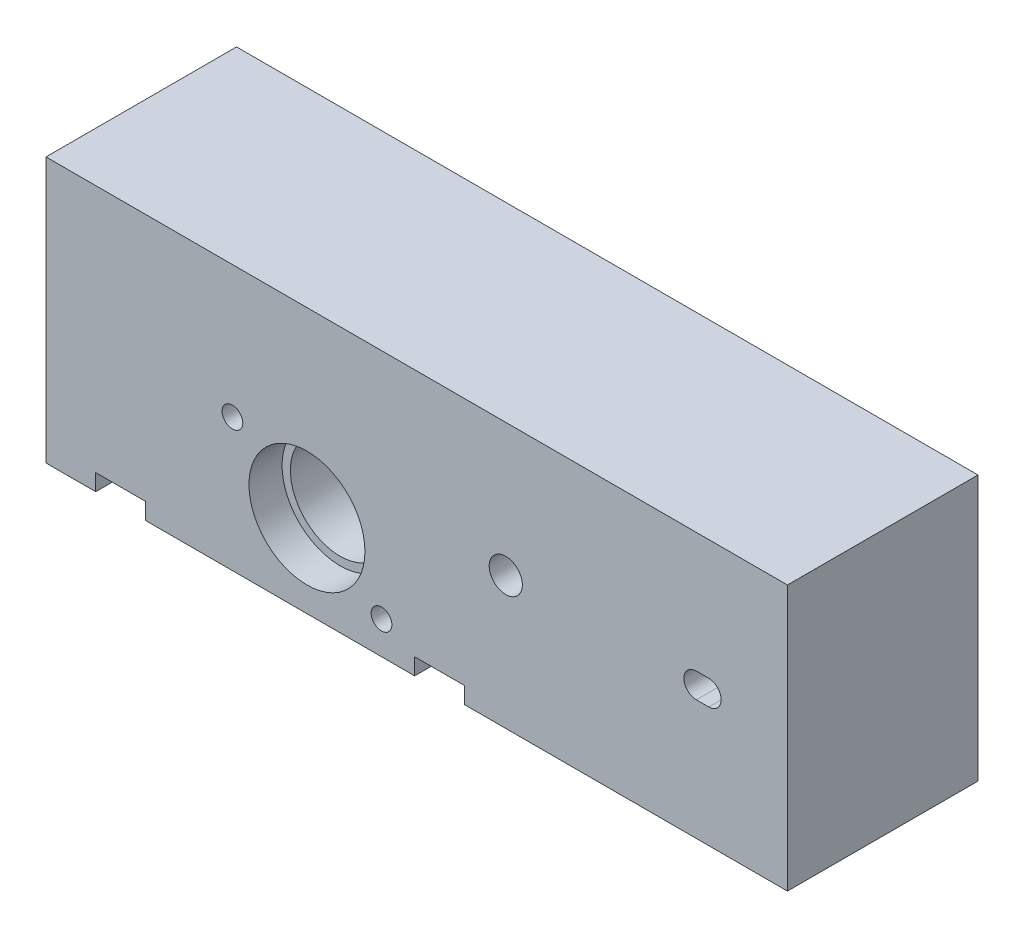
ISO-10303-21;
HEADER;
FILE_DESCRIPTION(('STEP AP214'),'2;1');
FILE_NAME('part.step','',(''),(''),'','','');
FILE_SCHEMA(('AUTOMOTIVE_DESIGN { 1 0 10303 214 1 1 1 1 }'));
ENDSEC;
DATA;
#1=APPLICATION_CONTEXT('core data for automotive mechanical design processes');
#2=APPLICATION_PROTOCOL_DEFINITION('international standard','automotive_design',2000,#1);
#3=PRODUCT_CONTEXT('',#1,'mechanical');
#4=PRODUCT('Part','Part','',(#3));
#5=PRODUCT_RELATED_PRODUCT_CATEGORY('part','',(#4));
#6=PRODUCT_DEFINITION_FORMATION('','',#4);
#7=PRODUCT_DEFINITION_CONTEXT('part definition',#1,'design');
#8=PRODUCT_DEFINITION('design','',#6,#7);
#9=PRODUCT_DEFINITION_SHAPE('','',#8);
#10=(LENGTH_UNIT() NAMED_UNIT(*) SI_UNIT(.MILLI.,.METRE.));
#11=(NAMED_UNIT(*) PLANE_ANGLE_UNIT() SI_UNIT($,.RADIAN.));
#12=(NAMED_UNIT(*) SI_UNIT($,.STERADIAN.) SOLID_ANGLE_UNIT());
#13=UNCERTAINTY_MEASURE_WITH_UNIT(LENGTH_MEASURE(1.E-05),#10,'distance_accuracy_value','');
#14=(GEOMETRIC_REPRESENTATION_CONTEXT(3) GLOBAL_UNCERTAINTY_ASSIGNED_CONTEXT((#13)) GLOBAL_UNIT_ASSIGNED_CONTEXT((#10,
#11,#12)) REPRESENTATION_CONTEXT('',''));
#15=CARTESIAN_POINT('',(0.,0.,0.));
#16=DIRECTION('',(0.,0.,1.));
#17=DIRECTION('',(1.,0.,0.));
#18=AXIS2_PLACEMENT_3D('',#15,#16,#17);
#19=CARTESIAN_POINT('',(0.,0.,73.025));
#20=DIRECTION('',(0.,0.,-1.));
#21=DIRECTION('',(-1.,0.,0.));
#22=AXIS2_PLACEMENT_3D('',#19,#20,#21);
#23=PLANE('',#22);
#24=CARTESIAN_POINT('',(34.13125,0.,73.025));
#25=DIRECTION('',(0.,0.,1.));
#26=DIRECTION('',(1.,0.,0.));
#27=AXIS2_PLACEMENT_3D('',#24,#25,#26);
#28=CIRCLE('',#27,6.35);
#29=CARTESIAN_POINT('',(40.48125,0.,73.025));
#30=VERTEX_POINT('',#29);
#31=EDGE_CURVE('E415',#30,#30,#28,.T.);
#32=ORIENTED_EDGE('',*,*,#31,.F.);
#33=EDGE_LOOP('',(#32));
#34=FACE_BOUND('',#33,.T.);
#35=CARTESIAN_POINT('',(-42.06875,-19.05,73.025));
#36=DIRECTION('',(0.,0.,1.));
#37=DIRECTION('',(1.,0.,0.));
#38=AXIS2_PLACEMENT_3D('',#35,#36,#37);
#39=CIRCLE('',#38,22.225);
#40=CARTESIAN_POINT('',(-19.84375,-19.05,73.025));
#41=VERTEX_POINT('',#40);
#42=EDGE_CURVE('E234',#41,#41,#39,.T.);
#43=ORIENTED_EDGE('',*,*,#42,.F.);
#44=EDGE_LOOP('',(#43));
#45=FACE_BOUND('',#44,.T.);
#46=CARTESIAN_POINT('',(111.91875,0.,73.025));
#47=DIRECTION('',(0.,0.,1.));
#48=DIRECTION('',(1.,0.,0.));
#49=AXIS2_PLACEMENT_3D('',#46,#47,#48);
#50=CIRCLE('',#49,4.7625);
#51=CARTESIAN_POINT('',(111.91875,-4.76250000000001,73.025));
#52=VERTEX_POINT('',#51);
#53=CARTESIAN_POINT('',(111.91875,4.76249999999999,73.025));
#54=VERTEX_POINT('',#53);
#55=EDGE_CURVE('E259',#52,#54,#50,.T.);
#56=ORIENTED_EDGE('',*,*,#55,.F.);
#57=DIRECTION('',(1.,0.,0.));
#58=VECTOR('',#57,1.);
#59=CARTESIAN_POINT('',(0.,-4.76250000000001,73.025));
#60=LINE('',#59,#58);
#61=CARTESIAN_POINT('',(107.15625,-4.76250000000001,73.025));
#62=VERTEX_POINT('',#61);
#63=EDGE_CURVE('E262',#62,#52,#60,.T.);
#64=ORIENTED_EDGE('',*,*,#63,.F.);
#65=CARTESIAN_POINT('',(107.15625,0.,73.025));
#66=DIRECTION('',(0.,0.,1.));
#67=DIRECTION('',(1.,0.,0.));
#68=AXIS2_PLACEMENT_3D('',#65,#66,#67);
#69=CIRCLE('',#68,4.7625);
#70=CARTESIAN_POINT('',(107.15625,4.76249999999999,73.025));
#71=VERTEX_POINT('',#70);
#72=EDGE_CURVE('E246',#71,#62,#69,.T.);
#73=ORIENTED_EDGE('',*,*,#72,.F.);
#74=DIRECTION('',(1.,0.,0.));
#75=VECTOR('',#74,1.);
#76=CARTESIAN_POINT('',(0.,4.76249999999999,73.025));
#77=LINE('',#76,#75);
#78=EDGE_CURVE('E256',#71,#54,#77,.T.);
#79=ORIENTED_EDGE('',*,*,#78,.T.);
#80=EDGE_LOOP('',(#56,#64,#73,#79));
#81=FACE_BOUND('',#80,.T.);
#82=CARTESIAN_POINT('',(-13.4994677031419,-38.2765804563584,73.025));
#83=DIRECTION('',(0.,0.,1.));
#84=DIRECTION('',(1.,0.,0.));
#85=AXIS2_PLACEMENT_3D('',#82,#83,#84);
#86=CIRCLE('',#85,3.96875);
#87=CARTESIAN_POINT('',(-9.53071770314189,-38.2765804563584,73.025));
#88=VERTEX_POINT('',#87);
#89=EDGE_CURVE('E253',#88,#88,#86,.T.);
#90=ORIENTED_EDGE('',*,*,#89,.F.);
#91=EDGE_LOOP('',(#90));
#92=FACE_BOUND('',#91,.T.);
#93=CARTESIAN_POINT('',(-70.6380322968581,0.176580456358433,73.025));
#94=DIRECTION('',(0.,0.,1.));
#95=DIRECTION('',(1.,0.,0.));
#96=AXIS2_PLACEMENT_3D('',#93,#94,#95);
#97=CIRCLE('',#96,3.96874999999999);
#98=CARTESIAN_POINT('',(-66.6692822968581,0.176580456358433,73.025));
#99=VERTEX_POINT('',#98);
#100=EDGE_CURVE('E231',#99,#99,#97,.T.);
#101=ORIENTED_EDGE('',*,*,#100,.F.);
#102=EDGE_LOOP('',(#101));
#103=FACE_BOUND('',#102,.T.);
#104=DIRECTION('',(0.,1.,0.));
#105=VECTOR('',#104,1.);
#106=CARTESIAN_POINT('',(-103.98125,0.,73.025));
#107=LINE('',#106,#105);
#108=CARTESIAN_POINT('',(-103.98125,-50.8,73.025));
#109=VERTEX_POINT('',#108);
#110=CARTESIAN_POINT('',(-103.98125,-44.45,73.025));
#111=VERTEX_POINT('',#110);
#112=EDGE_CURVE('E175',#109,#111,#107,.T.);
#113=ORIENTED_EDGE('',*,*,#112,.F.);
#114=DIRECTION('',(1.,0.,0.));
#115=VECTOR('',#114,1.);
#116=CARTESIAN_POINT('',(142.08125,-50.8,73.025));
#117=LINE('',#116,#115);
#118=CARTESIAN_POINT('',(-0.793749999999954,-50.8,73.025));
#119=VERTEX_POINT('',#118);
#120=EDGE_CURVE('E186',#109,#119,#117,.T.);
#121=ORIENTED_EDGE('',*,*,#120,.T.);
#122=DIRECTION('',(0.,1.,0.));
#123=VECTOR('',#122,1.);
#124=CARTESIAN_POINT('',(-0.793750000000065,0.,73.025));
#125=LINE('',#124,#123);
#126=CARTESIAN_POINT('',(-0.793749999999968,-44.45,73.025));
#127=VERTEX_POINT('',#126);
#128=EDGE_CURVE('E354',#119,#127,#125,.T.);
#129=ORIENTED_EDGE('',*,*,#128,.T.);
#130=DIRECTION('',(1.,0.,0.));
#131=VECTOR('',#130,1.);
#132=CARTESIAN_POINT('',(0.,-44.45,73.025));
#133=LINE('',#132,#131);
#134=CARTESIAN_POINT('',(18.25625,-44.45,73.025));
#135=VERTEX_POINT('',#134);
#136=EDGE_CURVE('E335',#127,#135,#133,.T.);
#137=ORIENTED_EDGE('',*,*,#136,.T.);
#138=DIRECTION('',(0.,1.,0.));
#139=VECTOR('',#138,1.);
#140=CARTESIAN_POINT('',(18.25625,0.,73.025));
#141=LINE('',#140,#139);
#142=CARTESIAN_POINT('',(18.25625,-50.8,73.025));
#143=VERTEX_POINT('',#142);
#144=EDGE_CURVE('E351',#143,#135,#141,.T.);
#145=ORIENTED_EDGE('',*,*,#144,.F.);
#146=CARTESIAN_POINT('',(142.08125,-50.8,73.025));
#147=VERTEX_POINT('',#146);
#148=EDGE_CURVE('E194',#143,#147,#117,.T.);
#149=ORIENTED_EDGE('',*,*,#148,.T.);
#150=DIRECTION('',(0.,1.,0.));
#151=VECTOR('',#150,1.);
#152=CARTESIAN_POINT('',(142.08125,50.8,73.025));
#153=LINE('',#152,#151);
#154=CARTESIAN_POINT('',(142.08125,50.8,73.025));
#155=VERTEX_POINT('',#154);
#156=EDGE_CURVE('E197',#147,#155,#153,.T.);
#157=ORIENTED_EDGE('',*,*,#156,.T.);
#158=DIRECTION('',(-1.,0.,0.));
#159=VECTOR('',#158,1.);
#160=CARTESIAN_POINT('',(142.08125,50.8,73.025));
#161=LINE('',#160,#159);
#162=CARTESIAN_POINT('',(-142.08125,50.8,73.025));
#163=VERTEX_POINT('',#162);
#164=EDGE_CURVE('E203',#155,#163,#161,.T.);
#165=ORIENTED_EDGE('',*,*,#164,.T.);
#166=DIRECTION('',(0.,-1.,0.));
#167=VECTOR('',#166,1.);
#168=CARTESIAN_POINT('',(-142.08125,50.8,73.025));
#169=LINE('',#168,#167);
#170=CARTESIAN_POINT('',(-142.08125,-50.8,73.025));
#171=VERTEX_POINT('',#170);
#172=EDGE_CURVE('E198',#163,#171,#169,.T.);
#173=ORIENTED_EDGE('',*,*,#172,.T.);
#174=CARTESIAN_POINT('',(-123.03125,-50.8,73.025));
#175=VERTEX_POINT('',#174);
#176=EDGE_CURVE('E193',#171,#175,#117,.T.);
#177=ORIENTED_EDGE('',*,*,#176,.T.);
#178=DIRECTION('',(0.,1.,0.));
#179=VECTOR('',#178,1.);
#180=CARTESIAN_POINT('',(-123.03125,0.,73.025));
#181=LINE('',#180,#179);
#182=CARTESIAN_POINT('',(-123.03125,-44.45,73.025));
#183=VERTEX_POINT('',#182);
#184=EDGE_CURVE('E50',#175,#183,#181,.T.);
#185=ORIENTED_EDGE('',*,*,#184,.T.);
#186=DIRECTION('',(1.,0.,0.));
#187=VECTOR('',#186,1.);
#188=CARTESIAN_POINT('',(0.,-44.45,73.025));
#189=LINE('',#188,#187);
#190=EDGE_CURVE('E181',#183,#111,#189,.T.);
#191=ORIENTED_EDGE('',*,*,#190,.T.);
#192=EDGE_LOOP('',(#113,#121,#129,#137,#145,#149,#157,#165,#173,#177,#185,#191));
#193=FACE_BOUND('',#192,.T.);
#194=ADVANCED_FACE('F33',(#34,#45,#81,#92,#103,#193),#23,.F.);
#195=CARTESIAN_POINT('',(0.,0.,0.));
#196=DIRECTION('',(0.,0.,-1.));
#197=DIRECTION('',(-1.,0.,0.));
#198=AXIS2_PLACEMENT_3D('',#195,#196,#197);
#199=PLANE('',#198);
#200=DIRECTION('',(1.,0.,0.));
#201=VECTOR('',#200,1.);
#202=CARTESIAN_POINT('',(0.,19.05,0.));
#203=LINE('',#202,#201);
#204=CARTESIAN_POINT('',(-0.793749999999982,19.05,0.));
#205=VERTEX_POINT('',#204);
#206=CARTESIAN_POINT('',(123.03125,19.05,0.));
#207=VERTEX_POINT('',#206);
#208=EDGE_CURVE('E370',#205,#207,#203,.T.);
#209=ORIENTED_EDGE('',*,*,#208,.F.);
#210=DIRECTION('',(0.,-1.,0.));
#211=VECTOR('',#210,1.);
#212=CARTESIAN_POINT('',(-0.793749999999984,0.,0.));
#213=LINE('',#212,#211);
#214=CARTESIAN_POINT('',(-0.793749999999986,-19.05,0.));
#215=VERTEX_POINT('',#214);
#216=EDGE_CURVE('E378',#205,#215,#213,.T.);
#217=ORIENTED_EDGE('',*,*,#216,.T.);
#218=DIRECTION('',(1.,0.,0.));
#219=VECTOR('',#218,1.);
#220=CARTESIAN_POINT('',(0.,-19.05,0.));
#221=LINE('',#220,#219);
#222=CARTESIAN_POINT('',(123.03125,-19.05,0.));
#223=VERTEX_POINT('',#222);
#224=EDGE_CURVE('E402',#215,#223,#221,.T.);
#225=ORIENTED_EDGE('',*,*,#224,.T.);
#226=DIRECTION('',(0.,-1.,0.));
#227=VECTOR('',#226,1.);
#228=CARTESIAN_POINT('',(123.03125,0.,0.));
#229=LINE('',#228,#227);
#230=EDGE_CURVE('E399',#207,#223,#229,.T.);
#231=ORIENTED_EDGE('',*,*,#230,.F.);
#232=EDGE_LOOP('',(#209,#217,#225,#231));
#233=FACE_BOUND('',#232,.T.);
#234=CARTESIAN_POINT('',(-13.4994677031419,-38.2765804563584,0.));
#235=DIRECTION('',(0.,0.,1.));
#236=DIRECTION('',(1.,0.,0.));
#237=AXIS2_PLACEMENT_3D('',#234,#235,#236);
#238=CIRCLE('',#237,3.96875);
#239=CARTESIAN_POINT('',(-9.53071770314189,-38.2765804563584,0.));
#240=VERTEX_POINT('',#239);
#241=EDGE_CURVE('E267',#240,#240,#238,.T.);
#242=ORIENTED_EDGE('',*,*,#241,.T.);
#243=EDGE_LOOP('',(#242));
#244=FACE_BOUND('',#243,.T.);
#245=CARTESIAN_POINT('',(-70.6380322968581,0.176580456358433,0.));
#246=DIRECTION('',(0.,0.,1.));
#247=DIRECTION('',(1.,0.,0.));
#248=AXIS2_PLACEMENT_3D('',#245,#246,#247);
#249=CIRCLE('',#248,3.96874999999999);
#250=CARTESIAN_POINT('',(-66.6692822968581,0.176580456358433,0.));
#251=VERTEX_POINT('',#250);
#252=EDGE_CURVE('E226',#251,#251,#249,.T.);
#253=ORIENTED_EDGE('',*,*,#252,.T.);
#254=EDGE_LOOP('',(#253));
#255=FACE_BOUND('',#254,.T.);
#256=CARTESIAN_POINT('',(-42.06875,-19.05,0.));
#257=DIRECTION('',(0.,0.,1.));
#258=DIRECTION('',(1.,0.,0.));
#259=AXIS2_PLACEMENT_3D('',#256,#257,#258);
#260=CIRCLE('',#259,19.05);
#261=CARTESIAN_POINT('',(-23.01875,-19.05,0.));
#262=VERTEX_POINT('',#261);
#263=EDGE_CURVE('E210',#262,#262,#260,.T.);
#264=ORIENTED_EDGE('',*,*,#263,.T.);
#265=EDGE_LOOP('',(#264));
#266=FACE_BOUND('',#265,.T.);
#267=DIRECTION('',(1.,0.,0.));
#268=VECTOR('',#267,1.);
#269=CARTESIAN_POINT('',(142.08125,-50.8,0.));
#270=LINE('',#269,#268);
#271=CARTESIAN_POINT('',(-103.98125,-50.8,0.));
#272=VERTEX_POINT('',#271);
#273=CARTESIAN_POINT('',(-0.793749999999899,-50.8,0.));
#274=VERTEX_POINT('',#273);
#275=EDGE_CURVE('E58',#272,#274,#270,.T.);
#276=ORIENTED_EDGE('',*,*,#275,.F.);
#277=DIRECTION('',(0.,1.,0.));
#278=VECTOR('',#277,1.);
#279=CARTESIAN_POINT('',(-103.98125,0.,0.));
#280=LINE('',#279,#278);
#281=CARTESIAN_POINT('',(-103.98125,-44.45,0.));
#282=VERTEX_POINT('',#281);
#283=EDGE_CURVE('E178',#272,#282,#280,.T.);
#284=ORIENTED_EDGE('',*,*,#283,.T.);
#285=DIRECTION('',(1.,0.,0.));
#286=VECTOR('',#285,1.);
#287=CARTESIAN_POINT('',(0.,-44.45,0.));
#288=LINE('',#287,#286);
#289=CARTESIAN_POINT('',(-123.03125,-44.45,0.));
#290=VERTEX_POINT('',#289);
#291=EDGE_CURVE('E189',#290,#282,#288,.T.);
#292=ORIENTED_EDGE('',*,*,#291,.F.);
#293=DIRECTION('',(0.,1.,0.));
#294=VECTOR('',#293,1.);
#295=CARTESIAN_POINT('',(-123.03125,0.,0.));
#296=LINE('',#295,#294);
#297=CARTESIAN_POINT('',(-123.03125,-50.8,0.));
#298=VERTEX_POINT('',#297);
#299=EDGE_CURVE('E644',#298,#290,#296,.T.);
#300=ORIENTED_EDGE('',*,*,#299,.F.);
#301=CARTESIAN_POINT('',(-142.08125,-50.8,0.));
#302=VERTEX_POINT('',#301);
#303=EDGE_CURVE('E211',#302,#298,#270,.T.);
#304=ORIENTED_EDGE('',*,*,#303,.F.);
#305=DIRECTION('',(0.,-1.,0.));
#306=VECTOR('',#305,1.);
#307=CARTESIAN_POINT('',(-142.08125,50.8,0.));
#308=LINE('',#307,#306);
#309=CARTESIAN_POINT('',(-142.08125,50.8,0.));
#310=VERTEX_POINT('',#309);
#311=EDGE_CURVE('E206',#310,#302,#308,.T.);
#312=ORIENTED_EDGE('',*,*,#311,.F.);
#313=DIRECTION('',(-1.,0.,0.));
#314=VECTOR('',#313,1.);
#315=CARTESIAN_POINT('',(142.08125,50.8,0.));
#316=LINE('',#315,#314);
#317=CARTESIAN_POINT('',(142.08125,50.8,0.));
#318=VERTEX_POINT('',#317);
#319=EDGE_CURVE('E216',#318,#310,#316,.T.);
#320=ORIENTED_EDGE('',*,*,#319,.F.);
#321=DIRECTION('',(0.,1.,0.));
#322=VECTOR('',#321,1.);
#323=CARTESIAN_POINT('',(142.08125,50.8,0.));
#324=LINE('',#323,#322);
#325=CARTESIAN_POINT('',(142.08125,-50.8,0.));
#326=VERTEX_POINT('',#325);
#327=EDGE_CURVE('E214',#326,#318,#324,.T.);
#328=ORIENTED_EDGE('',*,*,#327,.F.);
#329=CARTESIAN_POINT('',(18.25625,-50.8,0.));
#330=VERTEX_POINT('',#329);
#331=EDGE_CURVE('E209',#330,#326,#270,.T.);
#332=ORIENTED_EDGE('',*,*,#331,.F.);
#333=DIRECTION('',(0.,1.,0.));
#334=VECTOR('',#333,1.);
#335=CARTESIAN_POINT('',(18.25625,0.,0.));
#336=LINE('',#335,#334);
#337=CARTESIAN_POINT('',(18.25625,-44.45,0.));
#338=VERTEX_POINT('',#337);
#339=EDGE_CURVE('E340',#330,#338,#336,.T.);
#340=ORIENTED_EDGE('',*,*,#339,.T.);
#341=DIRECTION('',(1.,0.,0.));
#342=VECTOR('',#341,1.);
#343=CARTESIAN_POINT('',(0.,-44.45,0.));
#344=LINE('',#343,#342);
#345=CARTESIAN_POINT('',(-0.793749999999968,-44.45,0.));
#346=VERTEX_POINT('',#345);
#347=EDGE_CURVE('E355',#346,#338,#344,.T.);
#348=ORIENTED_EDGE('',*,*,#347,.F.);
#349=DIRECTION('',(0.,1.,0.));
#350=VECTOR('',#349,1.);
#351=CARTESIAN_POINT('',(-0.793750000000065,0.,0.));
#352=LINE('',#351,#350);
#353=EDGE_CURVE('E359',#274,#346,#352,.T.);
#354=ORIENTED_EDGE('',*,*,#353,.F.);
#355=EDGE_LOOP('',(#276,#284,#292,#300,#304,#312,#320,#328,#332,#340,#348,#354));
#356=FACE_BOUND('',#355,.T.);
#357=ADVANCED_FACE('F274',(#233,#244,#255,#266,#356),#199,.T.);
#358=CARTESIAN_POINT('',(142.08125,-50.8,73.025));
#359=DIRECTION('',(0.,1.,0.));
#360=DIRECTION('',(-1.,0.,0.));
#361=AXIS2_PLACEMENT_3D('',#358,#359,#360);
#362=PLANE('',#361);
#363=DIRECTION('',(0.,0.,-1.));
#364=VECTOR('',#363,1.);
#365=CARTESIAN_POINT('',(-103.98125,-50.8,73.025));
#366=LINE('',#365,#364);
#367=EDGE_CURVE('E172',#109,#272,#366,.T.);
#368=ORIENTED_EDGE('',*,*,#367,.T.);
#369=ORIENTED_EDGE('',*,*,#275,.T.);
#370=DIRECTION('',(0.,0.,-1.));
#371=VECTOR('',#370,1.);
#372=CARTESIAN_POINT('',(-0.793749999999954,-50.8,73.025));
#373=LINE('',#372,#371);
#374=EDGE_CURVE('E192',#119,#274,#373,.T.);
#375=ORIENTED_EDGE('',*,*,#374,.F.);
#376=ORIENTED_EDGE('',*,*,#120,.F.);
#377=EDGE_LOOP('',(#368,#369,#375,#376));
#378=FACE_BOUND('',#377,.T.);
#379=ADVANCED_FACE('F191',(#378),#362,.F.);
#380=DIRECTION('',(0.,0.,-1.));
#381=VECTOR('',#380,1.);
#382=CARTESIAN_POINT('',(18.25625,-50.8,73.025));
#383=LINE('',#382,#381);
#384=EDGE_CURVE('E330',#143,#330,#383,.T.);
#385=ORIENTED_EDGE('',*,*,#384,.T.);
#386=ORIENTED_EDGE('',*,*,#331,.T.);
#387=DIRECTION('',(0.,0.,-1.));
#388=VECTOR('',#387,1.);
#389=CARTESIAN_POINT('',(142.08125,-50.8,73.025));
#390=LINE('',#389,#388);
#391=EDGE_CURVE('E42',#147,#326,#390,.T.);
#392=ORIENTED_EDGE('',*,*,#391,.F.);
#393=ORIENTED_EDGE('',*,*,#148,.F.);
#394=EDGE_LOOP('',(#385,#386,#392,#393));
#395=FACE_BOUND('',#394,.T.);
#396=ADVANCED_FACE('F314',(#395),#362,.F.);
#397=CARTESIAN_POINT('',(34.13125,0.,0.));
#398=DIRECTION('',(0.,0.,1.));
#399=DIRECTION('',(1.,0.,0.));
#400=AXIS2_PLACEMENT_3D('',#397,#398,#399);
#401=CYLINDRICAL_SURFACE('',#400,4.7625);
#402=CARTESIAN_POINT('',(34.13125,0.,60.325));
#403=DIRECTION('',(0.,0.,1.));
#404=DIRECTION('',(1.,0.,0.));
#405=AXIS2_PLACEMENT_3D('',#402,#403,#404);
#406=CIRCLE('',#405,4.7625);
#407=CARTESIAN_POINT('',(38.89375,0.,60.325));
#408=VERTEX_POINT('',#407);
#409=EDGE_CURVE('E37',#408,#408,#406,.F.);
#410=ORIENTED_EDGE('',*,*,#409,.F.);
#411=EDGE_LOOP('',(#410));
#412=FACE_BOUND('',#411,.T.);
#413=CARTESIAN_POINT('',(34.13125,0.,31.75));
#414=DIRECTION('',(0.,0.,-1.));
#415=DIRECTION('',(-1.,0.,0.));
#416=AXIS2_PLACEMENT_3D('',#413,#414,#415);
#417=CIRCLE('',#416,4.7625);
#418=CARTESIAN_POINT('',(29.36875,0.,31.75));
#419=VERTEX_POINT('',#418);
#420=EDGE_CURVE('E374',#419,#419,#417,.F.);
#421=ORIENTED_EDGE('',*,*,#420,.F.);
#422=EDGE_LOOP('',(#421));
#423=FACE_BOUND('',#422,.T.);
#424=ADVANCED_FACE('F320',(#412,#423),#401,.F.);
#425=CARTESIAN_POINT('',(0.,-4.76250000000001,0.));
#426=DIRECTION('',(0.,-1.,0.));
#427=DIRECTION('',(0.,0.,-1.));
#428=AXIS2_PLACEMENT_3D('',#425,#426,#427);
#429=PLANE('',#428);
#430=DIRECTION('',(1.,0.,0.));
#431=VECTOR('',#430,1.);
#432=CARTESIAN_POINT('',(0.,-4.76250000000001,31.75));
#433=LINE('',#432,#431);
#434=CARTESIAN_POINT('',(107.15625,-4.76250000000001,31.75));
#435=VERTEX_POINT('',#434);
#436=CARTESIAN_POINT('',(111.91875,-4.76250000000001,31.75));
#437=VERTEX_POINT('',#436);
#438=EDGE_CURVE('E380',#435,#437,#433,.T.);
#439=ORIENTED_EDGE('',*,*,#438,.F.);
#440=DIRECTION('',(0.,0.,1.));
#441=VECTOR('',#440,1.);
#442=CARTESIAN_POINT('',(107.15625,-4.76250000000001,0.));
#443=LINE('',#442,#441);
#444=EDGE_CURVE('E251',#435,#62,#443,.T.);
#445=ORIENTED_EDGE('',*,*,#444,.T.);
#446=ORIENTED_EDGE('',*,*,#63,.T.);
#447=DIRECTION('',(0.,0.,1.));
#448=VECTOR('',#447,1.);
#449=CARTESIAN_POINT('',(111.91875,-4.76250000000001,0.));
#450=LINE('',#449,#448);
#451=EDGE_CURVE('E244',#437,#52,#450,.T.);
#452=ORIENTED_EDGE('',*,*,#451,.F.);
#453=EDGE_LOOP('',(#439,#445,#446,#452));
#454=FACE_BOUND('',#453,.T.);
#455=ADVANCED_FACE('F325',(#454),#429,.F.);
#456=CARTESIAN_POINT('',(107.15625,0.,0.));
#457=DIRECTION('',(0.,0.,1.));
#458=DIRECTION('',(1.,0.,0.));
#459=AXIS2_PLACEMENT_3D('',#456,#457,#458);
#460=CYLINDRICAL_SURFACE('',#459,4.7625);
#461=CARTESIAN_POINT('',(107.15625,0.,31.75));
#462=DIRECTION('',(0.,0.,-1.));
#463=DIRECTION('',(-1.,0.,0.));
#464=AXIS2_PLACEMENT_3D('',#461,#462,#463);
#465=CIRCLE('',#464,4.7625);
#466=CARTESIAN_POINT('',(107.15625,4.76249999999999,31.75));
#467=VERTEX_POINT('',#466);
#468=EDGE_CURVE('E377',#467,#435,#465,.F.);
#469=ORIENTED_EDGE('',*,*,#468,.F.);
#470=DIRECTION('',(0.,0.,1.));
#471=VECTOR('',#470,1.);
#472=CARTESIAN_POINT('',(107.15625,4.76249999999999,0.));
#473=LINE('',#472,#471);
#474=EDGE_CURVE('E249',#467,#71,#473,.T.);
#475=ORIENTED_EDGE('',*,*,#474,.T.);
#476=ORIENTED_EDGE('',*,*,#72,.T.);
#477=ORIENTED_EDGE('',*,*,#444,.F.);
#478=EDGE_LOOP('',(#469,#475,#476,#477));
#479=FACE_BOUND('',#478,.T.);
#480=ADVANCED_FACE('F449',(#479),#460,.F.);
#481=CARTESIAN_POINT('',(0.,4.76249999999999,0.));
#482=DIRECTION('',(0.,-1.,0.));
#483=DIRECTION('',(0.,0.,-1.));
#484=AXIS2_PLACEMENT_3D('',#481,#482,#483);
#485=PLANE('',#484);
#486=ORIENTED_EDGE('',*,*,#474,.F.);
#487=DIRECTION('',(-1.,0.,0.));
#488=VECTOR('',#487,1.);
#489=CARTESIAN_POINT('',(0.,4.76249999999999,31.75));
#490=LINE('',#489,#488);
#491=CARTESIAN_POINT('',(111.91875,4.76249999999999,31.75));
#492=VERTEX_POINT('',#491);
#493=EDGE_CURVE('E384',#492,#467,#490,.T.);
#494=ORIENTED_EDGE('',*,*,#493,.F.);
#495=DIRECTION('',(0.,0.,1.));
#496=VECTOR('',#495,1.);
#497=CARTESIAN_POINT('',(111.91875,4.76249999999999,0.));
#498=LINE('',#497,#496);
#499=EDGE_CURVE('E247',#492,#54,#498,.T.);
#500=ORIENTED_EDGE('',*,*,#499,.T.);
#501=ORIENTED_EDGE('',*,*,#78,.F.);
#502=EDGE_LOOP('',(#486,#494,#500,#501));
#503=FACE_BOUND('',#502,.T.);
#504=ADVANCED_FACE('F288',(#503),#485,.T.);
#505=CARTESIAN_POINT('',(111.91875,0.,0.));
#506=DIRECTION('',(0.,0.,1.));
#507=DIRECTION('',(1.,0.,0.));
#508=AXIS2_PLACEMENT_3D('',#505,#506,#507);
#509=CYLINDRICAL_SURFACE('',#508,4.7625);
#510=CARTESIAN_POINT('',(111.91875,0.,31.75));
#511=DIRECTION('',(0.,0.,-1.));
#512=DIRECTION('',(-1.,0.,0.));
#513=AXIS2_PLACEMENT_3D('',#510,#511,#512);
#514=CIRCLE('',#513,4.7625);
#515=EDGE_CURVE('E382',#437,#492,#514,.F.);
#516=ORIENTED_EDGE('',*,*,#515,.F.);
#517=ORIENTED_EDGE('',*,*,#451,.T.);
#518=ORIENTED_EDGE('',*,*,#55,.T.);
#519=ORIENTED_EDGE('',*,*,#499,.F.);
#520=EDGE_LOOP('',(#516,#517,#518,#519));
#521=FACE_BOUND('',#520,.T.);
#522=ADVANCED_FACE('F280',(#521),#509,.F.);
#523=CARTESIAN_POINT('',(-42.06875,-19.05,0.));
#524=DIRECTION('',(0.,0.,1.));
#525=DIRECTION('',(1.,0.,0.));
#526=AXIS2_PLACEMENT_3D('',#523,#524,#525);
#527=CYLINDRICAL_SURFACE('',#526,19.05);
#528=ORIENTED_EDGE('',*,*,#263,.F.);
#529=EDGE_LOOP('',(#528));
#530=FACE_BOUND('',#529,.T.);
#531=CARTESIAN_POINT('',(-42.06875,-19.05,60.325));
#532=DIRECTION('',(0.,0.,1.));
#533=DIRECTION('',(1.,0.,0.));
#534=AXIS2_PLACEMENT_3D('',#531,#532,#533);
#535=CIRCLE('',#534,19.05);
#536=CARTESIAN_POINT('',(-23.01875,-19.05,60.325));
#537=VERTEX_POINT('',#536);
#538=EDGE_CURVE('E224',#537,#537,#535,.F.);
#539=ORIENTED_EDGE('',*,*,#538,.F.);
#540=EDGE_LOOP('',(#539));
#541=FACE_BOUND('',#540,.T.);
#542=ADVANCED_FACE('F277',(#530,#541),#527,.F.);
#543=CARTESIAN_POINT('',(-142.08125,50.8,73.025));
#544=DIRECTION('',(1.,0.,0.));
#545=DIRECTION('',(0.,0.,-1.));
#546=AXIS2_PLACEMENT_3D('',#543,#544,#545);
#547=PLANE('',#546);
#548=ORIENTED_EDGE('',*,*,#311,.T.);
#549=DIRECTION('',(0.,0.,-1.));
#550=VECTOR('',#549,1.);
#551=CARTESIAN_POINT('',(-142.08125,-50.8,73.025));
#552=LINE('',#551,#550);
#553=EDGE_CURVE('E11',#171,#302,#552,.T.);
#554=ORIENTED_EDGE('',*,*,#553,.F.);
#555=ORIENTED_EDGE('',*,*,#172,.F.);
#556=DIRECTION('',(0.,0.,-1.));
#557=VECTOR('',#556,1.);
#558=CARTESIAN_POINT('',(-142.08125,50.8,73.025));
#559=LINE('',#558,#557);
#560=EDGE_CURVE('E205',#163,#310,#559,.T.);
#561=ORIENTED_EDGE('',*,*,#560,.T.);
#562=EDGE_LOOP('',(#548,#554,#555,#561));
#563=FACE_BOUND('',#562,.T.);
#564=ADVANCED_FACE('F35',(#563),#547,.F.);
#565=ORIENTED_EDGE('',*,*,#303,.T.);
#566=DIRECTION('',(0.,0.,-1.));
#567=VECTOR('',#566,1.);
#568=CARTESIAN_POINT('',(-123.03125,-50.8,73.025));
#569=LINE('',#568,#567);
#570=EDGE_CURVE('E180',#175,#298,#569,.T.);
#571=ORIENTED_EDGE('',*,*,#570,.F.);
#572=ORIENTED_EDGE('',*,*,#176,.F.);
#573=ORIENTED_EDGE('',*,*,#553,.T.);
#574=EDGE_LOOP('',(#565,#571,#572,#573));
#575=FACE_BOUND('',#574,.T.);
#576=ADVANCED_FACE('F285',(#575),#362,.F.);
#577=CARTESIAN_POINT('',(142.08125,50.8,73.025));
#578=DIRECTION('',(-1.,0.,0.));
#579=DIRECTION('',(0.,0.,1.));
#580=AXIS2_PLACEMENT_3D('',#577,#578,#579);
#581=PLANE('',#580);
#582=ORIENTED_EDGE('',*,*,#327,.T.);
#583=DIRECTION('',(0.,0.,-1.));
#584=VECTOR('',#583,1.);
#585=CARTESIAN_POINT('',(142.08125,50.8,73.025));
#586=LINE('',#585,#584);
#587=EDGE_CURVE('E220',#155,#318,#586,.T.);
#588=ORIENTED_EDGE('',*,*,#587,.F.);
#589=ORIENTED_EDGE('',*,*,#156,.F.);
#590=ORIENTED_EDGE('',*,*,#391,.T.);
#591=EDGE_LOOP('',(#582,#588,#589,#590));
#592=FACE_BOUND('',#591,.T.);
#593=ADVANCED_FACE('F308',(#592),#581,.F.);
#594=CARTESIAN_POINT('',(142.08125,50.8,73.025));
#595=DIRECTION('',(0.,-1.,0.));
#596=DIRECTION('',(1.,0.,0.));
#597=AXIS2_PLACEMENT_3D('',#594,#595,#596);
#598=PLANE('',#597);
#599=ORIENTED_EDGE('',*,*,#319,.T.);
#600=ORIENTED_EDGE('',*,*,#560,.F.);
#601=ORIENTED_EDGE('',*,*,#164,.F.);
#602=ORIENTED_EDGE('',*,*,#587,.T.);
#603=EDGE_LOOP('',(#599,#600,#601,#602));
#604=FACE_BOUND('',#603,.T.);
#605=ADVANCED_FACE('F304',(#604),#598,.F.);
#606=CARTESIAN_POINT('',(-70.6380322968581,0.176580456358433,0.));
#607=DIRECTION('',(0.,0.,1.));
#608=DIRECTION('',(1.,0.,0.));
#609=AXIS2_PLACEMENT_3D('',#606,#607,#608);
#610=CYLINDRICAL_SURFACE('',#609,3.96874999999999);
#611=ORIENTED_EDGE('',*,*,#252,.F.);
#612=EDGE_LOOP('',(#611));
#613=FACE_BOUND('',#612,.T.);
#614=ORIENTED_EDGE('',*,*,#100,.T.);
#615=EDGE_LOOP('',(#614));
#616=FACE_BOUND('',#615,.T.);
#617=ADVANCED_FACE('F307',(#613,#616),#610,.F.);
#618=CARTESIAN_POINT('',(-13.4994677031419,-38.2765804563584,0.));
#619=DIRECTION('',(0.,0.,1.));
#620=DIRECTION('',(1.,0.,0.));
#621=AXIS2_PLACEMENT_3D('',#618,#619,#620);
#622=CYLINDRICAL_SURFACE('',#621,3.96875);
#623=ORIENTED_EDGE('',*,*,#241,.F.);
#624=EDGE_LOOP('',(#623));
#625=FACE_BOUND('',#624,.T.);
#626=ORIENTED_EDGE('',*,*,#89,.T.);
#627=EDGE_LOOP('',(#626));
#628=FACE_BOUND('',#627,.T.);
#629=ADVANCED_FACE('F444',(#625,#628),#622,.F.);
#630=CARTESIAN_POINT('',(-42.06875,-19.05,60.325));
#631=DIRECTION('',(0.,0.,1.));
#632=DIRECTION('',(1.,0.,0.));
#633=AXIS2_PLACEMENT_3D('',#630,#631,#632);
#634=PLANE('',#633);
#635=CARTESIAN_POINT('',(-42.06875,-19.05,60.325));
#636=DIRECTION('',(0.,0.,1.));
#637=DIRECTION('',(1.,0.,0.));
#638=AXIS2_PLACEMENT_3D('',#635,#636,#637);
#639=CIRCLE('',#638,22.225);
#640=CARTESIAN_POINT('',(-19.84375,-19.05,60.325));
#641=VERTEX_POINT('',#640);
#642=EDGE_CURVE('E227',#641,#641,#639,.T.);
#643=ORIENTED_EDGE('',*,*,#642,.T.);
#644=EDGE_LOOP('',(#643));
#645=FACE_BOUND('',#644,.T.);
#646=ORIENTED_EDGE('',*,*,#538,.T.);
#647=EDGE_LOOP('',(#646));
#648=FACE_BOUND('',#647,.T.);
#649=ADVANCED_FACE('F441',(#645,#648),#634,.T.);
#650=CARTESIAN_POINT('',(-42.06875,-19.05,60.325));
#651=DIRECTION('',(0.,0.,1.));
#652=DIRECTION('',(1.,0.,0.));
#653=AXIS2_PLACEMENT_3D('',#650,#651,#652);
#654=CYLINDRICAL_SURFACE('',#653,22.225);
#655=ORIENTED_EDGE('',*,*,#642,.F.);
#656=EDGE_LOOP('',(#655));
#657=FACE_BOUND('',#656,.T.);
#658=ORIENTED_EDGE('',*,*,#42,.T.);
#659=EDGE_LOOP('',(#658));
#660=FACE_BOUND('',#659,.T.);
#661=ADVANCED_FACE('F437',(#657,#660),#654,.F.);
#662=CARTESIAN_POINT('',(34.13125,0.,60.325));
#663=DIRECTION('',(0.,0.,1.));
#664=DIRECTION('',(1.,0.,0.));
#665=AXIS2_PLACEMENT_3D('',#662,#663,#664);
#666=PLANE('',#665);
#667=CARTESIAN_POINT('',(34.13125,0.,60.325));
#668=DIRECTION('',(0.,0.,1.));
#669=DIRECTION('',(1.,0.,0.));
#670=AXIS2_PLACEMENT_3D('',#667,#668,#669);
#671=CIRCLE('',#670,6.35);
#672=CARTESIAN_POINT('',(40.48125,0.,60.325));
#673=VERTEX_POINT('',#672);
#674=EDGE_CURVE('E241',#673,#673,#671,.T.);
#675=ORIENTED_EDGE('',*,*,#674,.T.);
#676=EDGE_LOOP('',(#675));
#677=FACE_BOUND('',#676,.T.);
#678=ORIENTED_EDGE('',*,*,#409,.T.);
#679=EDGE_LOOP('',(#678));
#680=FACE_BOUND('',#679,.T.);
#681=ADVANCED_FACE('F422',(#677,#680),#666,.T.);
#682=CARTESIAN_POINT('',(34.13125,0.,60.325));
#683=DIRECTION('',(0.,0.,1.));
#684=DIRECTION('',(1.,0.,0.));
#685=AXIS2_PLACEMENT_3D('',#682,#683,#684);
#686=CYLINDRICAL_SURFACE('',#685,6.35);
#687=ORIENTED_EDGE('',*,*,#674,.F.);
#688=EDGE_LOOP('',(#687));
#689=FACE_BOUND('',#688,.T.);
#690=ORIENTED_EDGE('',*,*,#31,.T.);
#691=EDGE_LOOP('',(#690));
#692=FACE_BOUND('',#691,.T.);
#693=ADVANCED_FACE('F425',(#689,#692),#686,.F.);
#694=CARTESIAN_POINT('',(0.,19.05,31.75));
#695=DIRECTION('',(0.,1.,0.));
#696=DIRECTION('',(-1.,0.,0.));
#697=AXIS2_PLACEMENT_3D('',#694,#695,#696);
#698=PLANE('',#697);
#699=ORIENTED_EDGE('',*,*,#208,.T.);
#700=DIRECTION('',(0.,0.,-1.));
#701=VECTOR('',#700,1.);
#702=CARTESIAN_POINT('',(123.03125,19.05,31.75));
#703=LINE('',#702,#701);
#704=CARTESIAN_POINT('',(123.03125,19.05,31.75));
#705=VERTEX_POINT('',#704);
#706=EDGE_CURVE('E397',#705,#207,#703,.T.);
#707=ORIENTED_EDGE('',*,*,#706,.F.);
#708=DIRECTION('',(1.,0.,0.));
#709=VECTOR('',#708,1.);
#710=CARTESIAN_POINT('',(0.,19.05,31.75));
#711=LINE('',#710,#709);
#712=CARTESIAN_POINT('',(-0.793749999999982,19.05,31.75));
#713=VERTEX_POINT('',#712);
#714=EDGE_CURVE('E386',#713,#705,#711,.T.);
#715=ORIENTED_EDGE('',*,*,#714,.F.);
#716=DIRECTION('',(0.,0.,-1.));
#717=VECTOR('',#716,1.);
#718=CARTESIAN_POINT('',(-0.793749999999982,19.05,31.75));
#719=LINE('',#718,#717);
#720=EDGE_CURVE('E407',#713,#205,#719,.T.);
#721=ORIENTED_EDGE('',*,*,#720,.T.);
#722=EDGE_LOOP('',(#699,#707,#715,#721));
#723=FACE_BOUND('',#722,.T.);
#724=ADVANCED_FACE('F427',(#723),#698,.F.);
#725=CARTESIAN_POINT('',(-0.793749999999984,0.,31.75));
#726=DIRECTION('',(1.,0.,0.));
#727=DIRECTION('',(0.,1.,0.));
#728=AXIS2_PLACEMENT_3D('',#725,#726,#727);
#729=PLANE('',#728);
#730=ORIENTED_EDGE('',*,*,#216,.F.);
#731=ORIENTED_EDGE('',*,*,#720,.F.);
#732=DIRECTION('',(0.,-1.,0.));
#733=VECTOR('',#732,1.);
#734=CARTESIAN_POINT('',(-0.793749999999984,0.,31.75));
#735=LINE('',#734,#733);
#736=CARTESIAN_POINT('',(-0.793749999999986,-19.05,31.75));
#737=VERTEX_POINT('',#736);
#738=EDGE_CURVE('E394',#713,#737,#735,.T.);
#739=ORIENTED_EDGE('',*,*,#738,.T.);
#740=DIRECTION('',(0.,0.,-1.));
#741=VECTOR('',#740,1.);
#742=CARTESIAN_POINT('',(-0.793749999999986,-19.05,31.75));
#743=LINE('',#742,#741);
#744=EDGE_CURVE('E409',#737,#215,#743,.T.);
#745=ORIENTED_EDGE('',*,*,#744,.T.);
#746=EDGE_LOOP('',(#730,#731,#739,#745));
#747=FACE_BOUND('',#746,.T.);
#748=ADVANCED_FACE('F434',(#747),#729,.T.);
#749=CARTESIAN_POINT('',(0.,-19.05,31.75));
#750=DIRECTION('',(0.,1.,0.));
#751=DIRECTION('',(-1.,0.,0.));
#752=AXIS2_PLACEMENT_3D('',#749,#750,#751);
#753=PLANE('',#752);
#754=ORIENTED_EDGE('',*,*,#224,.F.);
#755=ORIENTED_EDGE('',*,*,#744,.F.);
#756=DIRECTION('',(1.,0.,0.));
#757=VECTOR('',#756,1.);
#758=CARTESIAN_POINT('',(0.,-19.05,31.75));
#759=LINE('',#758,#757);
#760=CARTESIAN_POINT('',(123.03125,-19.05,31.75));
#761=VERTEX_POINT('',#760);
#762=EDGE_CURVE('E392',#737,#761,#759,.T.);
#763=ORIENTED_EDGE('',*,*,#762,.T.);
#764=DIRECTION('',(0.,0.,-1.));
#765=VECTOR('',#764,1.);
#766=CARTESIAN_POINT('',(123.03125,-19.05,31.75));
#767=LINE('',#766,#765);
#768=EDGE_CURVE('E412',#761,#223,#767,.T.);
#769=ORIENTED_EDGE('',*,*,#768,.T.);
#770=EDGE_LOOP('',(#754,#755,#763,#769));
#771=FACE_BOUND('',#770,.T.);
#772=ADVANCED_FACE('F530',(#771),#753,.T.);
#773=CARTESIAN_POINT('',(123.03125,0.,31.75));
#774=DIRECTION('',(1.,0.,0.));
#775=DIRECTION('',(0.,0.,-1.));
#776=AXIS2_PLACEMENT_3D('',#773,#774,#775);
#777=PLANE('',#776);
#778=ORIENTED_EDGE('',*,*,#230,.T.);
#779=ORIENTED_EDGE('',*,*,#768,.F.);
#780=DIRECTION('',(0.,-1.,0.));
#781=VECTOR('',#780,1.);
#782=CARTESIAN_POINT('',(123.03125,0.,31.75));
#783=LINE('',#782,#781);
#784=EDGE_CURVE('E389',#705,#761,#783,.T.);
#785=ORIENTED_EDGE('',*,*,#784,.F.);
#786=ORIENTED_EDGE('',*,*,#706,.T.);
#787=EDGE_LOOP('',(#778,#779,#785,#786));
#788=FACE_BOUND('',#787,.T.);
#789=ADVANCED_FACE('F540',(#788),#777,.F.);
#790=CARTESIAN_POINT('',(0.,0.,31.75));
#791=DIRECTION('',(0.,0.,-1.));
#792=DIRECTION('',(-1.,0.,0.));
#793=AXIS2_PLACEMENT_3D('',#790,#791,#792);
#794=PLANE('',#793);
#795=ORIENTED_EDGE('',*,*,#420,.T.);
#796=EDGE_LOOP('',(#795));
#797=FACE_BOUND('',#796,.T.);
#798=ORIENTED_EDGE('',*,*,#468,.T.);
#799=ORIENTED_EDGE('',*,*,#438,.T.);
#800=ORIENTED_EDGE('',*,*,#515,.T.);
#801=ORIENTED_EDGE('',*,*,#493,.T.);
#802=EDGE_LOOP('',(#798,#799,#800,#801));
#803=FACE_BOUND('',#802,.T.);
#804=ORIENTED_EDGE('',*,*,#714,.T.);
#805=ORIENTED_EDGE('',*,*,#784,.T.);
#806=ORIENTED_EDGE('',*,*,#762,.F.);
#807=ORIENTED_EDGE('',*,*,#738,.F.);
#808=EDGE_LOOP('',(#804,#805,#806,#807));
#809=FACE_BOUND('',#808,.T.);
#810=ADVANCED_FACE('F549',(#797,#803,#809),#794,.T.);
#811=CARTESIAN_POINT('',(18.25625,0.,73.025));
#812=DIRECTION('',(-1.,0.,0.));
#813=DIRECTION('',(0.,0.,1.));
#814=AXIS2_PLACEMENT_3D('',#811,#812,#813);
#815=PLANE('',#814);
#816=ORIENTED_EDGE('',*,*,#339,.F.);
#817=ORIENTED_EDGE('',*,*,#384,.F.);
#818=ORIENTED_EDGE('',*,*,#144,.T.);
#819=DIRECTION('',(0.,0.,-1.));
#820=VECTOR('',#819,1.);
#821=CARTESIAN_POINT('',(18.25625,-44.45,73.025));
#822=LINE('',#821,#820);
#823=EDGE_CURVE('E368',#135,#338,#822,.T.);
#824=ORIENTED_EDGE('',*,*,#823,.T.);
#825=EDGE_LOOP('',(#816,#817,#818,#824));
#826=FACE_BOUND('',#825,.T.);
#827=ADVANCED_FACE('F557',(#826),#815,.T.);
#828=CARTESIAN_POINT('',(0.,-44.45,73.025));
#829=DIRECTION('',(0.,1.,0.));
#830=DIRECTION('',(0.,0.,1.));
#831=AXIS2_PLACEMENT_3D('',#828,#829,#830);
#832=PLANE('',#831);
#833=ORIENTED_EDGE('',*,*,#347,.T.);
#834=ORIENTED_EDGE('',*,*,#823,.F.);
#835=ORIENTED_EDGE('',*,*,#136,.F.);
#836=DIRECTION('',(0.,0.,-1.));
#837=VECTOR('',#836,1.);
#838=CARTESIAN_POINT('',(-0.793749999999968,-44.45,73.025));
#839=LINE('',#838,#837);
#840=EDGE_CURVE('E371',#127,#346,#839,.T.);
#841=ORIENTED_EDGE('',*,*,#840,.T.);
#842=EDGE_LOOP('',(#833,#834,#835,#841));
#843=FACE_BOUND('',#842,.T.);
#844=ADVANCED_FACE('F567',(#843),#832,.F.);
#845=CARTESIAN_POINT('',(-0.793750000000065,0.,73.025));
#846=DIRECTION('',(-1.,0.,0.));
#847=DIRECTION('',(0.,-1.,0.));
#848=AXIS2_PLACEMENT_3D('',#845,#846,#847);
#849=PLANE('',#848);
#850=ORIENTED_EDGE('',*,*,#353,.T.);
#851=ORIENTED_EDGE('',*,*,#840,.F.);
#852=ORIENTED_EDGE('',*,*,#128,.F.);
#853=ORIENTED_EDGE('',*,*,#374,.T.);
#854=EDGE_LOOP('',(#850,#851,#852,#853));
#855=FACE_BOUND('',#854,.T.);
#856=ADVANCED_FACE('F574',(#855),#849,.F.);
#857=CARTESIAN_POINT('',(-103.98125,0.,73.025));
#858=DIRECTION('',(-1.,0.,0.));
#859=DIRECTION('',(0.,0.,1.));
#860=AXIS2_PLACEMENT_3D('',#857,#858,#859);
#861=PLANE('',#860);
#862=ORIENTED_EDGE('',*,*,#283,.F.);
#863=ORIENTED_EDGE('',*,*,#367,.F.);
#864=ORIENTED_EDGE('',*,*,#112,.T.);
#865=DIRECTION('',(0.,0.,-1.));
#866=VECTOR('',#865,1.);
#867=CARTESIAN_POINT('',(-103.98125,-44.45,73.025));
#868=LINE('',#867,#866);
#869=EDGE_CURVE('E365',#111,#282,#868,.T.);
#870=ORIENTED_EDGE('',*,*,#869,.T.);
#871=EDGE_LOOP('',(#862,#863,#864,#870));
#872=FACE_BOUND('',#871,.T.);
#873=ADVANCED_FACE('F174',(#872),#861,.T.);
#874=CARTESIAN_POINT('',(0.,-44.45,73.025));
#875=DIRECTION('',(0.,1.,0.));
#876=DIRECTION('',(0.,0.,1.));
#877=AXIS2_PLACEMENT_3D('',#874,#875,#876);
#878=PLANE('',#877);
#879=ORIENTED_EDGE('',*,*,#291,.T.);
#880=ORIENTED_EDGE('',*,*,#869,.F.);
#881=ORIENTED_EDGE('',*,*,#190,.F.);
#882=DIRECTION('',(0.,0.,-1.));
#883=VECTOR('',#882,1.);
#884=CARTESIAN_POINT('',(-123.03125,-44.45,73.025));
#885=LINE('',#884,#883);
#886=EDGE_CURVE('E646',#183,#290,#885,.T.);
#887=ORIENTED_EDGE('',*,*,#886,.T.);
#888=EDGE_LOOP('',(#879,#880,#881,#887));
#889=FACE_BOUND('',#888,.T.);
#890=ADVANCED_FACE('F589',(#889),#878,.F.);
#891=CARTESIAN_POINT('',(-123.03125,0.,73.025));
#892=DIRECTION('',(-1.,0.,0.));
#893=DIRECTION('',(0.,0.,1.));
#894=AXIS2_PLACEMENT_3D('',#891,#892,#893);
#895=PLANE('',#894);
#896=ORIENTED_EDGE('',*,*,#299,.T.);
#897=ORIENTED_EDGE('',*,*,#886,.F.);
#898=ORIENTED_EDGE('',*,*,#184,.F.);
#899=ORIENTED_EDGE('',*,*,#570,.T.);
#900=EDGE_LOOP('',(#896,#897,#898,#899));
#901=FACE_BOUND('',#900,.T.);
#902=ADVANCED_FACE('F596',(#901),#895,.F.);
#903=CLOSED_SHELL('',(#194,#357,#379,#396,#424,#455,#480,#504,#522,#542,#564,#576,#593,#605,
#617,#629,#649,#661,#681,#693,#724,#748,#772,#789,#810,#827,#844,#856,#873,#890,#902));
#904=MANIFOLD_SOLID_BREP('B2',#903);
#905=ADVANCED_BREP_SHAPE_REPRESENTATION('',(#18,#904),#14);
#906=SHAPE_DEFINITION_REPRESENTATION(#9,#905);
ENDSEC;
END-ISO-10303-21;
